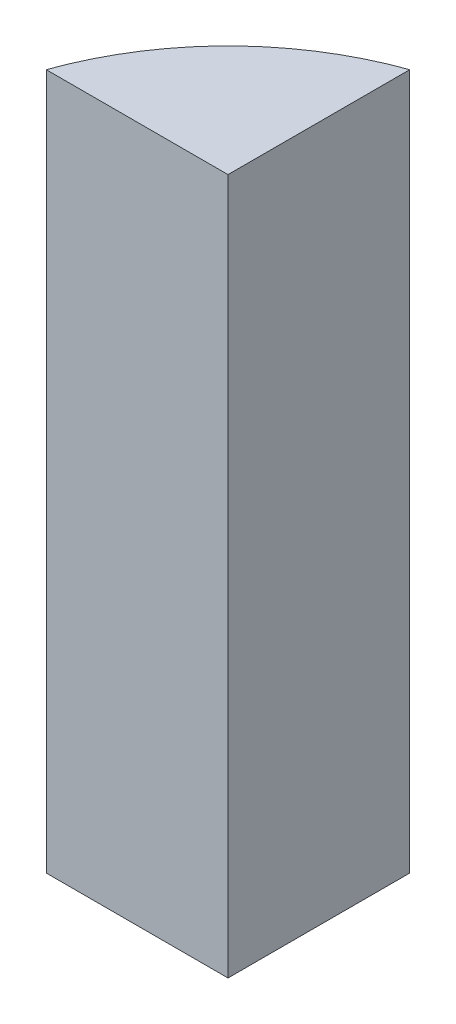
ISO-10303-21;
HEADER;
FILE_DESCRIPTION(('STEP AP214'),'2;1');
FILE_NAME('part.step','',(''),(''),'','','');
FILE_SCHEMA(('AUTOMOTIVE_DESIGN { 1 0 10303 214 1 1 1 1 }'));
ENDSEC;
DATA;
#1=APPLICATION_CONTEXT('core data for automotive mechanical design processes');
#2=APPLICATION_PROTOCOL_DEFINITION('international standard','automotive_design',2000,#1);
#3=PRODUCT_CONTEXT('',#1,'mechanical');
#4=PRODUCT('Part','Part','',(#3));
#5=PRODUCT_RELATED_PRODUCT_CATEGORY('part','',(#4));
#6=PRODUCT_DEFINITION_FORMATION('','',#4);
#7=PRODUCT_DEFINITION_CONTEXT('part definition',#1,'design');
#8=PRODUCT_DEFINITION('design','',#6,#7);
#9=PRODUCT_DEFINITION_SHAPE('','',#8);
#10=(LENGTH_UNIT() NAMED_UNIT(*) SI_UNIT(.MILLI.,.METRE.));
#11=(NAMED_UNIT(*) PLANE_ANGLE_UNIT() SI_UNIT($,.RADIAN.));
#12=(NAMED_UNIT(*) SI_UNIT($,.STERADIAN.) SOLID_ANGLE_UNIT());
#13=UNCERTAINTY_MEASURE_WITH_UNIT(LENGTH_MEASURE(1.E-05),#10,'distance_accuracy_value','');
#14=(GEOMETRIC_REPRESENTATION_CONTEXT(3) GLOBAL_UNCERTAINTY_ASSIGNED_CONTEXT((#13)) GLOBAL_UNIT_ASSIGNED_CONTEXT((#10,
#11,#12)) REPRESENTATION_CONTEXT('',''));
#15=CARTESIAN_POINT('',(0.,0.,0.));
#16=DIRECTION('',(0.,0.,1.));
#17=DIRECTION('',(1.,0.,0.));
#18=AXIS2_PLACEMENT_3D('',#15,#16,#17);
#19=CARTESIAN_POINT('',(-20.,140.,0.));
#20=DIRECTION('',(1.,0.,0.));
#21=DIRECTION('',(0.,0.,-1.));
#22=AXIS2_PLACEMENT_3D('',#19,#20,#21);
#23=PLANE('',#22);
#24=DIRECTION('',(0.,0.,1.));
#25=VECTOR('',#24,1.);
#26=CARTESIAN_POINT('',(-20.,0.,0.));
#27=LINE('',#26,#25);
#28=CARTESIAN_POINT('',(-20.,0.,-56.5685424949238));
#29=VERTEX_POINT('',#28);
#30=CARTESIAN_POINT('',(-20.,0.,-20.));
#31=VERTEX_POINT('',#30);
#32=EDGE_CURVE('E77',#29,#31,#27,.T.);
#33=ORIENTED_EDGE('',*,*,#32,.F.);
#34=DIRECTION('',(0.,-1.,0.));
#35=VECTOR('',#34,1.);
#36=CARTESIAN_POINT('',(-20.,140.,-56.5685424949238));
#37=LINE('',#36,#35);
#38=CARTESIAN_POINT('',(-20.,140.,-56.5685424949238));
#39=VERTEX_POINT('',#38);
#40=EDGE_CURVE('E11',#39,#29,#37,.T.);
#41=ORIENTED_EDGE('',*,*,#40,.F.);
#42=DIRECTION('',(0.,0.,1.));
#43=VECTOR('',#42,1.);
#44=CARTESIAN_POINT('',(-20.,140.,0.));
#45=LINE('',#44,#43);
#46=CARTESIAN_POINT('',(-20.,140.,-20.));
#47=VERTEX_POINT('',#46);
#48=EDGE_CURVE('E75',#39,#47,#45,.T.);
#49=ORIENTED_EDGE('',*,*,#48,.T.);
#50=DIRECTION('',(0.,-1.,0.));
#51=VECTOR('',#50,1.);
#52=CARTESIAN_POINT('',(-20.,140.,-20.));
#53=LINE('',#52,#51);
#54=EDGE_CURVE('E71',#47,#31,#53,.T.);
#55=ORIENTED_EDGE('',*,*,#54,.T.);
#56=EDGE_LOOP('',(#33,#41,#49,#55));
#57=FACE_BOUND('',#56,.T.);
#58=ADVANCED_FACE('F37',(#57),#23,.T.);
#59=CARTESIAN_POINT('',(0.,140.,0.));
#60=DIRECTION('',(0.,-1.,0.));
#61=DIRECTION('',(0.,0.,-1.));
#62=AXIS2_PLACEMENT_3D('',#59,#60,#61);
#63=CYLINDRICAL_SURFACE('',#62,60.);
#64=CARTESIAN_POINT('',(0.,0.,0.));
#65=DIRECTION('',(0.,1.,0.));
#66=DIRECTION('',(0.,0.,1.));
#67=AXIS2_PLACEMENT_3D('',#64,#65,#66);
#68=CIRCLE('',#67,60.);
#69=CARTESIAN_POINT('',(-56.5685424949238,0.,-20.));
#70=VERTEX_POINT('',#69);
#71=EDGE_CURVE('E65',#29,#70,#68,.T.);
#72=ORIENTED_EDGE('',*,*,#71,.T.);
#73=DIRECTION('',(0.,-1.,0.));
#74=VECTOR('',#73,1.);
#75=CARTESIAN_POINT('',(-56.5685424949238,140.,-20.));
#76=LINE('',#75,#74);
#77=CARTESIAN_POINT('',(-56.5685424949238,140.,-20.));
#78=VERTEX_POINT('',#77);
#79=EDGE_CURVE('E45',#78,#70,#76,.T.);
#80=ORIENTED_EDGE('',*,*,#79,.F.);
#81=CARTESIAN_POINT('',(0.,140.,0.));
#82=DIRECTION('',(0.,1.,0.));
#83=DIRECTION('',(0.,0.,1.));
#84=AXIS2_PLACEMENT_3D('',#81,#82,#83);
#85=CIRCLE('',#84,60.);
#86=EDGE_CURVE('E78',#39,#78,#85,.T.);
#87=ORIENTED_EDGE('',*,*,#86,.F.);
#88=ORIENTED_EDGE('',*,*,#40,.T.);
#89=EDGE_LOOP('',(#72,#80,#87,#88));
#90=FACE_BOUND('',#89,.T.);
#91=ADVANCED_FACE('F79',(#90),#63,.T.);
#92=CARTESIAN_POINT('',(0.,140.,-20.));
#93=DIRECTION('',(0.,0.,-1.));
#94=DIRECTION('',(-1.,0.,0.));
#95=AXIS2_PLACEMENT_3D('',#92,#93,#94);
#96=PLANE('',#95);
#97=DIRECTION('',(1.,0.,0.));
#98=VECTOR('',#97,1.);
#99=CARTESIAN_POINT('',(0.,0.,-20.));
#100=LINE('',#99,#98);
#101=EDGE_CURVE('E82',#70,#31,#100,.T.);
#102=ORIENTED_EDGE('',*,*,#101,.T.);
#103=ORIENTED_EDGE('',*,*,#54,.F.);
#104=DIRECTION('',(1.,0.,0.));
#105=VECTOR('',#104,1.);
#106=CARTESIAN_POINT('',(0.,140.,-20.));
#107=LINE('',#106,#105);
#108=EDGE_CURVE('E53',#78,#47,#107,.T.);
#109=ORIENTED_EDGE('',*,*,#108,.F.);
#110=ORIENTED_EDGE('',*,*,#79,.T.);
#111=EDGE_LOOP('',(#102,#103,#109,#110));
#112=FACE_BOUND('',#111,.T.);
#113=ADVANCED_FACE('F91',(#112),#96,.F.);
#114=CARTESIAN_POINT('',(0.,140.,0.));
#115=DIRECTION('',(0.,1.,0.));
#116=DIRECTION('',(0.,0.,1.));
#117=AXIS2_PLACEMENT_3D('',#114,#115,#116);
#118=PLANE('',#117);
#119=ORIENTED_EDGE('',*,*,#48,.F.);
#120=ORIENTED_EDGE('',*,*,#86,.T.);
#121=ORIENTED_EDGE('',*,*,#108,.T.);
#122=EDGE_LOOP('',(#119,#120,#121));
#123=FACE_BOUND('',#122,.T.);
#124=ADVANCED_FACE('F81',(#123),#118,.T.);
#125=CARTESIAN_POINT('',(0.,0.,0.));
#126=DIRECTION('',(0.,1.,0.));
#127=DIRECTION('',(0.,0.,1.));
#128=AXIS2_PLACEMENT_3D('',#125,#126,#127);
#129=PLANE('',#128);
#130=ORIENTED_EDGE('',*,*,#32,.T.);
#131=ORIENTED_EDGE('',*,*,#101,.F.);
#132=ORIENTED_EDGE('',*,*,#71,.F.);
#133=EDGE_LOOP('',(#130,#131,#132));
#134=FACE_BOUND('',#133,.T.);
#135=ADVANCED_FACE('F93',(#134),#129,.F.);
#136=CLOSED_SHELL('',(#58,#91,#113,#124,#135));
#137=MANIFOLD_SOLID_BREP('B2',#136);
#138=ADVANCED_BREP_SHAPE_REPRESENTATION('',(#18,#137),#14);
#139=SHAPE_DEFINITION_REPRESENTATION(#9,#138);
ENDSEC;
END-ISO-10303-21;
